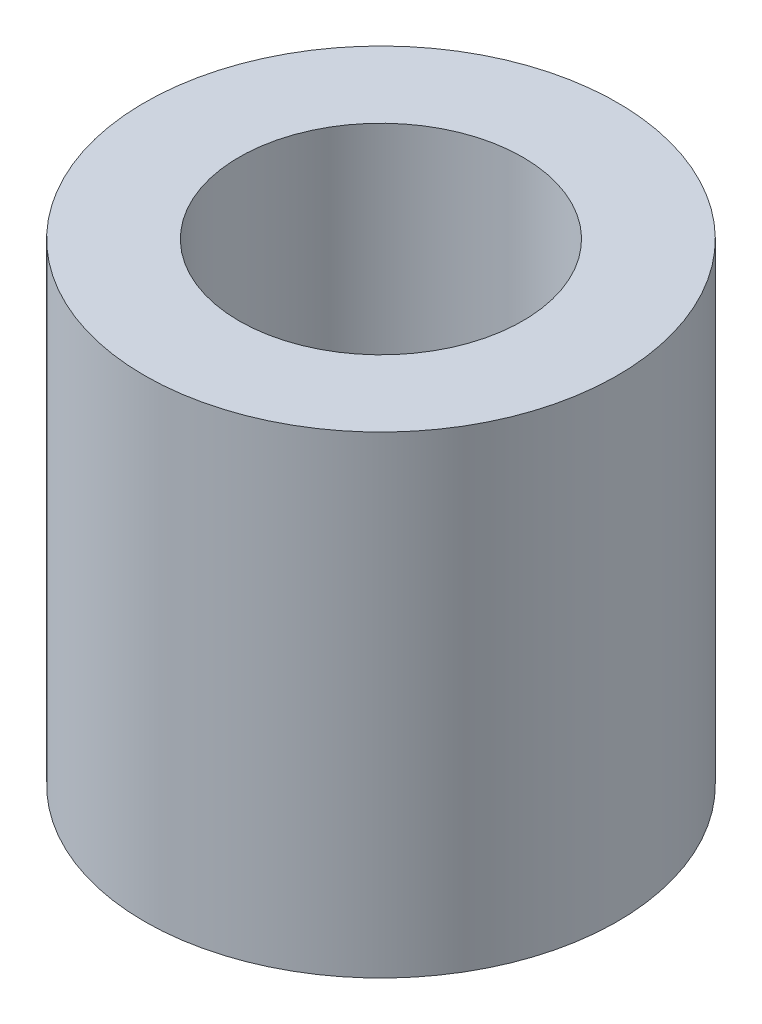
ISO-10303-21;
HEADER;
FILE_DESCRIPTION(('STEP AP214'),'2;1');
FILE_NAME('part.step','',(''),(''),'','','');
FILE_SCHEMA(('AUTOMOTIVE_DESIGN { 1 0 10303 214 1 1 1 1 }'));
ENDSEC;
DATA;
#1=APPLICATION_CONTEXT('core data for automotive mechanical design processes');
#2=APPLICATION_PROTOCOL_DEFINITION('international standard','automotive_design',2000,#1);
#3=PRODUCT_CONTEXT('',#1,'mechanical');
#4=PRODUCT('Part','Part','',(#3));
#5=PRODUCT_RELATED_PRODUCT_CATEGORY('part','',(#4));
#6=PRODUCT_DEFINITION_FORMATION('','',#4);
#7=PRODUCT_DEFINITION_CONTEXT('part definition',#1,'design');
#8=PRODUCT_DEFINITION('design','',#6,#7);
#9=PRODUCT_DEFINITION_SHAPE('','',#8);
#10=(LENGTH_UNIT() NAMED_UNIT(*) SI_UNIT(.MILLI.,.METRE.));
#11=(NAMED_UNIT(*) PLANE_ANGLE_UNIT() SI_UNIT($,.RADIAN.));
#12=(NAMED_UNIT(*) SI_UNIT($,.STERADIAN.) SOLID_ANGLE_UNIT());
#13=UNCERTAINTY_MEASURE_WITH_UNIT(LENGTH_MEASURE(1.E-05),#10,'distance_accuracy_value','');
#14=(GEOMETRIC_REPRESENTATION_CONTEXT(3) GLOBAL_UNCERTAINTY_ASSIGNED_CONTEXT((#13)) GLOBAL_UNIT_ASSIGNED_CONTEXT((#10,
#11,#12)) REPRESENTATION_CONTEXT('',''));
#15=CARTESIAN_POINT('',(0.,0.,0.));
#16=DIRECTION('',(0.,0.,1.));
#17=DIRECTION('',(1.,0.,0.));
#18=AXIS2_PLACEMENT_3D('',#15,#16,#17);
#19=CARTESIAN_POINT('',(0.,10.,0.));
#20=DIRECTION('',(0.,1.,0.));
#21=DIRECTION('',(0.,0.,1.));
#22=AXIS2_PLACEMENT_3D('',#19,#20,#21);
#23=PLANE('',#22);
#24=CARTESIAN_POINT('',(0.,10.,0.));
#25=DIRECTION('',(0.,1.,0.));
#26=DIRECTION('',(0.,0.,1.));
#27=AXIS2_PLACEMENT_3D('',#24,#25,#26);
#28=CIRCLE('',#27,5.);
#29=CARTESIAN_POINT('',(0.,10.,5.));
#30=VERTEX_POINT('',#29);
#31=EDGE_CURVE('E10',#30,#30,#28,.T.);
#32=ORIENTED_EDGE('',*,*,#31,.T.);
#33=EDGE_LOOP('',(#32));
#34=FACE_BOUND('',#33,.T.);
#35=CARTESIAN_POINT('',(0.,10.,0.));
#36=DIRECTION('',(0.,1.,0.));
#37=DIRECTION('',(0.,0.,1.));
#38=AXIS2_PLACEMENT_3D('',#35,#36,#37);
#39=CIRCLE('',#38,3.);
#40=CARTESIAN_POINT('',(0.,10.,3.));
#41=VERTEX_POINT('',#40);
#42=EDGE_CURVE('E44',#41,#41,#39,.T.);
#43=ORIENTED_EDGE('',*,*,#42,.F.);
#44=EDGE_LOOP('',(#43));
#45=FACE_BOUND('',#44,.T.);
#46=ADVANCED_FACE('F33',(#34,#45),#23,.T.);
#47=CARTESIAN_POINT('',(0.,0.,0.));
#48=DIRECTION('',(0.,1.,0.));
#49=DIRECTION('',(0.,0.,1.));
#50=AXIS2_PLACEMENT_3D('',#47,#48,#49);
#51=PLANE('',#50);
#52=CARTESIAN_POINT('',(0.,0.,0.));
#53=DIRECTION('',(0.,1.,0.));
#54=DIRECTION('',(0.,0.,1.));
#55=AXIS2_PLACEMENT_3D('',#52,#53,#54);
#56=CIRCLE('',#55,5.);
#57=CARTESIAN_POINT('',(0.,0.,5.));
#58=VERTEX_POINT('',#57);
#59=EDGE_CURVE('E37',#58,#58,#56,.T.);
#60=ORIENTED_EDGE('',*,*,#59,.F.);
#61=EDGE_LOOP('',(#60));
#62=FACE_BOUND('',#61,.T.);
#63=CARTESIAN_POINT('',(0.,0.,0.));
#64=DIRECTION('',(0.,1.,0.));
#65=DIRECTION('',(0.,0.,1.));
#66=AXIS2_PLACEMENT_3D('',#63,#64,#65);
#67=CIRCLE('',#66,3.);
#68=CARTESIAN_POINT('',(0.,0.,3.));
#69=VERTEX_POINT('',#68);
#70=EDGE_CURVE('E46',#69,#69,#67,.T.);
#71=ORIENTED_EDGE('',*,*,#70,.T.);
#72=EDGE_LOOP('',(#71));
#73=FACE_BOUND('',#72,.T.);
#74=ADVANCED_FACE('F56',(#62,#73),#51,.F.);
#75=CARTESIAN_POINT('',(0.,10.,0.));
#76=DIRECTION('',(0.,-1.,0.));
#77=DIRECTION('',(0.,0.,-1.));
#78=AXIS2_PLACEMENT_3D('',#75,#76,#77);
#79=CYLINDRICAL_SURFACE('',#78,5.);
#80=ORIENTED_EDGE('',*,*,#31,.F.);
#81=EDGE_LOOP('',(#80));
#82=FACE_BOUND('',#81,.T.);
#83=ORIENTED_EDGE('',*,*,#59,.T.);
#84=EDGE_LOOP('',(#83));
#85=FACE_BOUND('',#84,.T.);
#86=ADVANCED_FACE('F35',(#82,#85),#79,.T.);
#87=CARTESIAN_POINT('',(0.,10.,0.));
#88=DIRECTION('',(0.,-1.,0.));
#89=DIRECTION('',(0.,0.,-1.));
#90=AXIS2_PLACEMENT_3D('',#87,#88,#89);
#91=CYLINDRICAL_SURFACE('',#90,3.);
#92=ORIENTED_EDGE('',*,*,#42,.T.);
#93=EDGE_LOOP('',(#92));
#94=FACE_BOUND('',#93,.T.);
#95=ORIENTED_EDGE('',*,*,#70,.F.);
#96=EDGE_LOOP('',(#95));
#97=FACE_BOUND('',#96,.T.);
#98=ADVANCED_FACE('F52',(#94,#97),#91,.F.);
#99=CLOSED_SHELL('',(#46,#74,#86,#98));
#100=MANIFOLD_SOLID_BREP('B2',#99);
#101=ADVANCED_BREP_SHAPE_REPRESENTATION('',(#18,#100),#14);
#102=SHAPE_DEFINITION_REPRESENTATION(#9,#101);
ENDSEC;
END-ISO-10303-21;
